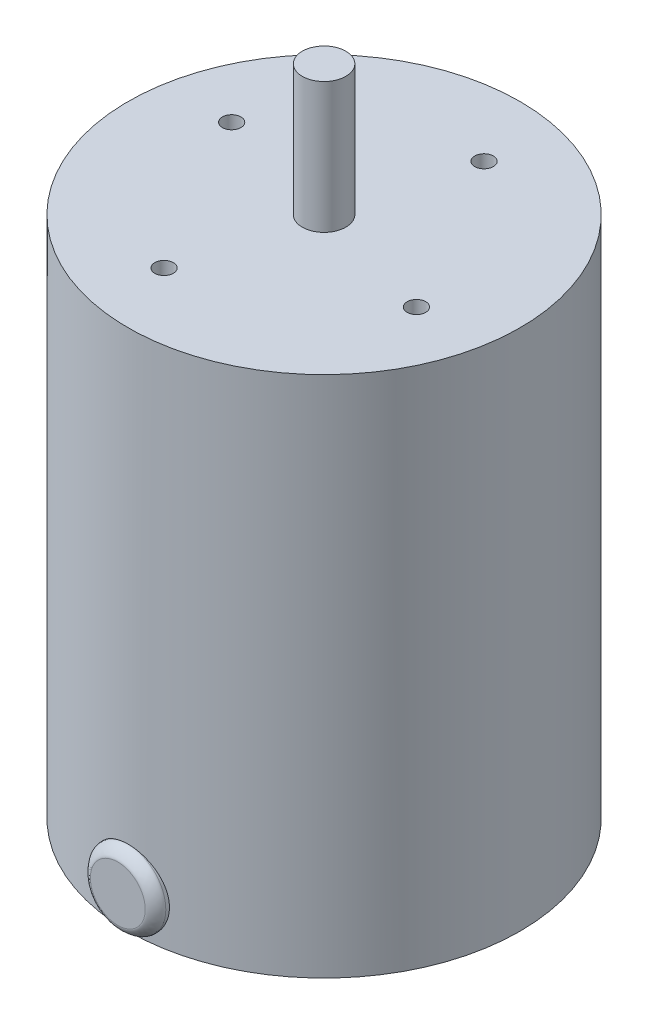
ISO-10303-21;
HEADER;
FILE_DESCRIPTION(('STEP AP214'),'2;1');
FILE_NAME('part.step','',(''),(''),'','','');
FILE_SCHEMA(('AUTOMOTIVE_DESIGN { 1 0 10303 214 1 1 1 1 }'));
ENDSEC;
DATA;
#1=APPLICATION_CONTEXT('core data for automotive mechanical design processes');
#2=APPLICATION_PROTOCOL_DEFINITION('international standard','automotive_design',2000,#1);
#3=PRODUCT_CONTEXT('',#1,'mechanical');
#4=PRODUCT('Part','Part','',(#3));
#5=PRODUCT_RELATED_PRODUCT_CATEGORY('part','',(#4));
#6=PRODUCT_DEFINITION_FORMATION('','',#4);
#7=PRODUCT_DEFINITION_CONTEXT('part definition',#1,'design');
#8=PRODUCT_DEFINITION('design','',#6,#7);
#9=PRODUCT_DEFINITION_SHAPE('','',#8);
#10=(LENGTH_UNIT() NAMED_UNIT(*) SI_UNIT(.MILLI.,.METRE.));
#11=(NAMED_UNIT(*) PLANE_ANGLE_UNIT() SI_UNIT($,.RADIAN.));
#12=(NAMED_UNIT(*) SI_UNIT($,.STERADIAN.) SOLID_ANGLE_UNIT());
#13=UNCERTAINTY_MEASURE_WITH_UNIT(LENGTH_MEASURE(1.E-05),#10,'distance_accuracy_value','');
#14=(GEOMETRIC_REPRESENTATION_CONTEXT(3) GLOBAL_UNCERTAINTY_ASSIGNED_CONTEXT((#13)) GLOBAL_UNIT_ASSIGNED_CONTEXT((#10,
#11,#12)) REPRESENTATION_CONTEXT('',''));
#15=CARTESIAN_POINT('',(0.,0.,0.));
#16=DIRECTION('',(0.,0.,1.));
#17=DIRECTION('',(1.,0.,0.));
#18=AXIS2_PLACEMENT_3D('',#15,#16,#17);
#19=CARTESIAN_POINT('',(0.,-32.6,30.075));
#20=DIRECTION('',(0.,0.,-1.));
#21=DIRECTION('',(-1.,0.,0.));
#22=AXIS2_PLACEMENT_3D('',#19,#20,#21);
#23=CYLINDRICAL_SURFACE('',#22,5.5);
#24=CARTESIAN_POINT('',(0.,-38.1,28.575));
#25=CARTESIAN_POINT('',(-0.153006913270102,-38.1000028735161,28.5750014135195));
#26=CARTESIAN_POINT('',(-0.30597716622993,-38.0936134209994,28.5737689058255));
#27=CARTESIAN_POINT('',(-0.610860455419747,-38.0681112960101,28.5688763669221));
#28=CARTESIAN_POINT('',(-0.762773300984089,-38.0489963860849,28.5652159088188));
#29=CARTESIAN_POINT('',(-1.06448198799602,-37.9981755090113,28.5555652321025));
#30=CARTESIAN_POINT('',(-1.2142766311677,-37.9664626887916,28.5495737454819));
#31=CARTESIAN_POINT('',(-1.51066151612007,-37.8906810230845,28.5354261414936));
#32=CARTESIAN_POINT('',(-1.65725055925804,-37.8466076380847,28.5272692289154));
#33=CARTESIAN_POINT('',(-1.94594968145314,-37.7465125893899,28.509030160619));
#34=CARTESIAN_POINT('',(-2.08806536884419,-37.6905066313405,28.4989505373798));
#35=CARTESIAN_POINT('',(-2.36709411085716,-37.5669062573569,28.4771326380655));
#36=CARTESIAN_POINT('',(-2.50400522445668,-37.4993075687734,28.4653937507288));
#37=CARTESIAN_POINT('',(-2.77158206846477,-37.3530589140845,28.4405872944954));
#38=CARTESIAN_POINT('',(-2.90225063305323,-37.2744140282082,28.4275203371473));
#39=CARTESIAN_POINT('',(-3.15658604520836,-37.1065716546991,28.4004041200368));
#40=CARTESIAN_POINT('',(-3.28025025588675,-37.01737023144,28.3863544947254));
#41=CARTESIAN_POINT('',(-3.52101462857159,-36.8280215311307,28.3575024217761));
#42=CARTESIAN_POINT('',(-3.63802843220877,-36.7277654279228,28.3426934319385));
#43=CARTESIAN_POINT('',(-3.86326379842358,-36.5177684185142,28.3128721805949));
#44=CARTESIAN_POINT('',(-3.97148208756064,-36.4080240121122,28.2978598458127));
#45=CARTESIAN_POINT('',(-4.17831387498992,-36.1798597018492,28.2680603342919));
#46=CARTESIAN_POINT('',(-4.27693017202682,-36.06144234368,28.2532730930107));
#47=CARTESIAN_POINT('',(-4.4639497173238,-35.8166575929403,28.2243288281481));
#48=CARTESIAN_POINT('',(-4.55234918539136,-35.6902872843451,28.2101720390152));
#49=CARTESIAN_POINT('',(-4.71893817882935,-35.4294451511424,28.182786130692));
#50=CARTESIAN_POINT('',(-4.79704005215595,-35.2949164375197,28.1695653701697));
#51=CARTESIAN_POINT('',(-4.94164550633549,-35.0195731361716,28.1445581122772));
#52=CARTESIAN_POINT('',(-5.00814474048044,-34.8787562173961,28.1327721529258));
#53=CARTESIAN_POINT('',(-5.12898008780221,-34.5919229128405,28.110993726943));
#54=CARTESIAN_POINT('',(-5.18332156701068,-34.4459088540214,28.1010004694598));
#55=CARTESIAN_POINT('',(-5.27947130272528,-34.1496714199404,28.0830939465203));
#56=CARTESIAN_POINT('',(-5.32127500517102,-33.9994465368049,28.0751814369764));
#57=CARTESIAN_POINT('',(-5.42641641667282,-33.5478846709585,28.0551234835715));
#58=CARTESIAN_POINT('',(-5.47110126328113,-33.2418055786103,28.0463557488694));
#59=CARTESIAN_POINT('',(-5.50857561608414,-32.6265473225984,28.039018419718));
#60=CARTESIAN_POINT('',(-5.50137002997062,-32.3173684548671,28.0404478608405));
#61=CARTESIAN_POINT('',(-5.43584481115057,-31.7090255233731,28.0532223049872));
#62=CARTESIAN_POINT('',(-5.37823775245012,-31.4097819710705,28.0644290703804));
#63=CARTESIAN_POINT('',(-5.21464941311624,-30.8252995645064,28.0952828382323));
#64=CARTESIAN_POINT('',(-5.10866597700575,-30.5400613348988,28.1149302167721));
#65=CARTESIAN_POINT('',(-4.8506476878374,-29.9895987437647,28.1605935116213));
#66=CARTESIAN_POINT('',(-4.69832710097745,-29.7245116937642,28.1866487447762));
#67=CARTESIAN_POINT('',(-4.35215890624948,-29.2233924146247,28.2421666163911));
#68=CARTESIAN_POINT('',(-4.15830686522648,-28.9873632914286,28.271629618449));
#69=CARTESIAN_POINT('',(-3.73074628029132,-28.5469426321258,28.3312444214922));
#70=CARTESIAN_POINT('',(-3.49642858142874,-28.3431424483467,28.3613995294216));
#71=CARTESIAN_POINT('',(-2.99662085427498,-27.9776509978255,28.4185512371304));
#72=CARTESIAN_POINT('',(-2.73113048075516,-27.8159601974967,28.4455478019232));
#73=CARTESIAN_POINT('',(-2.17588124314585,-27.5391814449428,28.4933996402519));
#74=CARTESIAN_POINT('',(-1.88608976197189,-27.4241573774253,28.5142464845147));
#75=CARTESIAN_POINT('',(-1.29080690996615,-27.244587828321,28.547385349609));
#76=CARTESIAN_POINT('',(-0.985317302247446,-27.1800366910862,28.5596783289105));
#77=CARTESIAN_POINT('',(-0.372395262036268,-27.1040739846306,28.5741920085104));
#78=CARTESIAN_POINT('',(-0.0650667196554244,-27.0918525484739,28.5765662001922));
#79=CARTESIAN_POINT('',(0.547241892603683,-27.1187203916882,28.571399705022));
#80=CARTESIAN_POINT('',(0.852222083514206,-27.157807008634,28.563859532636));
#81=CARTESIAN_POINT('',(1.44859078263083,-27.2855082661918,28.5398072946956));
#82=CARTESIAN_POINT('',(1.74007079649478,-27.3737108661614,28.523369900809));
#83=CARTESIAN_POINT('',(2.30410518271477,-27.5966928245188,28.4833590061907));
#84=CARTESIAN_POINT('',(2.57665821537438,-27.7314754759253,28.4597850009444));
#85=CARTESIAN_POINT('',(3.09854227741436,-28.0455679047289,28.407733057872));
#86=CARTESIAN_POINT('',(3.34757178905354,-28.2253696974633,28.3792020764164));
#87=CARTESIAN_POINT('',(3.81221454843162,-28.6237345658765,28.3205330168833));
#88=CARTESIAN_POINT('',(4.02782449204317,-28.8423014696111,28.2903947802951));
#89=CARTESIAN_POINT('',(4.42260437180253,-29.315662584127,28.2313953762539));
#90=CARTESIAN_POINT('',(4.60122031736766,-29.5709222510487,28.2025580733283));
#91=CARTESIAN_POINT('',(4.91303893990689,-30.1083105207375,28.1499163254468));
#92=CARTESIAN_POINT('',(5.046243358359,-30.3904380926215,28.1261116875075));
#93=CARTESIAN_POINT('',(5.26268843220945,-30.9721243169855,28.0864173876549));
#94=CARTESIAN_POINT('',(5.34617741890155,-31.2715879930546,28.0704884551131));
#95=CARTESIAN_POINT('',(5.46156497510848,-31.8808025750062,28.0482713700177));
#96=CARTESIAN_POINT('',(5.49346971637552,-32.1905522457034,28.0419820641442));
#97=CARTESIAN_POINT('',(5.50186978100187,-32.6529844630014,28.0403264865681));
#98=CARTESIAN_POINT('',(5.49827612031194,-32.8055458737975,28.0410350475612));
#99=CARTESIAN_POINT('',(5.47843944730317,-33.1097969680083,28.044918767282));
#100=CARTESIAN_POINT('',(5.4622012233326,-33.2614869595187,28.0480929922906));
#101=CARTESIAN_POINT('',(5.41718957246093,-33.5629686185655,28.0568208399768));
#102=CARTESIAN_POINT('',(5.38841173655711,-33.7127595993171,28.0623752995478));
#103=CARTESIAN_POINT('',(5.31856071844819,-34.0092913227827,28.0756977066599));
#104=CARTESIAN_POINT('',(5.27749193162675,-34.1560331358851,28.0834648628679));
#105=CARTESIAN_POINT('',(5.18345025732903,-34.4452443569294,28.1009741619849));
#106=CARTESIAN_POINT('',(5.13049820122538,-34.5877207526753,28.1107128459153));
#107=CARTESIAN_POINT('',(5.0130635003011,-34.8676471527138,28.1318924992467));
#108=CARTESIAN_POINT('',(4.94858494693893,-35.0050989197695,28.1433328643758));
#109=CARTESIAN_POINT('',(4.80851965042266,-35.2741638102336,28.1676022192011));
#110=CARTESIAN_POINT('',(4.73292835636715,-35.4057745127183,28.1804317772313));
#111=CARTESIAN_POINT('',(4.57121456544707,-35.6621829251598,28.2071149374004));
#112=CARTESIAN_POINT('',(4.48509570390442,-35.7869829655257,28.2209681853945));
#113=CARTESIAN_POINT('',(4.3014205620418,-36.0309576404473,28.2495518584386));
#114=CARTESIAN_POINT('',(4.20370215904739,-36.1500090189107,28.2642928302081));
#115=CARTESIAN_POINT('',(3.99868402962972,-36.379442585021,28.2940253981186));
#116=CARTESIAN_POINT('',(3.89138769486379,-36.4898278156319,28.3090169040261));
#117=CARTESIAN_POINT('',(3.66784441294628,-36.7012928784956,28.3388472211377));
#118=CARTESIAN_POINT('',(3.55159219672259,-36.8023671548039,28.3536859365397));
#119=CARTESIAN_POINT('',(3.31102156663799,-36.9944073762584,28.3827841011688));
#120=CARTESIAN_POINT('',(3.18670613965285,-37.0853770309942,28.3970437617495));
#121=CARTESIAN_POINT('',(2.92953146721386,-37.257469345533,28.4247314577111));
#122=CARTESIAN_POINT('',(2.79659941276987,-37.338484818735,28.4381497872752));
#123=CARTESIAN_POINT('',(2.52429708317203,-37.4889790467712,28.4636125798347));
#124=CARTESIAN_POINT('',(2.38492920358107,-37.5584620507124,28.4756575483268));
#125=CARTESIAN_POINT('',(2.10077161036086,-37.685366314255,28.4980292584493));
#126=CARTESIAN_POINT('',(1.95598536148904,-37.742795131672,28.508357075861));
#127=CARTESIAN_POINT('',(1.66199602267054,-37.8451888257538,28.52700660928));
#128=CARTESIAN_POINT('',(1.51279381371218,-37.8901561701897,28.5353287224385));
#129=CARTESIAN_POINT('',(1.13984644742973,-37.9854634805091,28.5531201540097));
#130=CARTESIAN_POINT('',(0.914091422433169,-38.028357961683,28.5612835498521));
#131=CARTESIAN_POINT('',(0.458863395995704,-38.0856236704625,28.5722223382772));
#132=CARTESIAN_POINT('',(0.229390498219257,-38.0999956919771,28.5749978808282));
#133=CARTESIAN_POINT('',(0.,-38.1,28.575));
#134=B_SPLINE_CURVE_WITH_KNOTS('',3,(#24,#25,#26,#27,#28,#29,#30,#31,#32,#33,#34,#35,#36,#37,
#38,#39,#40,#41,#42,#43,#44,#45,#46,#47,#48,#49,#50,#51,#52,#53,#54,#55,#56,#57,#58,#59,#60,#61,
#62,#63,#64,#65,#66,#67,#68,#69,#70,#71,#72,#73,#74,#75,#76,#77,#78,#79,#80,#81,#82,#83,#84,#85,
#86,#87,#88,#89,#90,#91,#92,#93,#94,#95,#96,#97,#98,#99,#100,#101,#102,#103,#104,#105,#106,#107,
#108,#109,#110,#111,#112,#113,#114,#115,#116,#117,#118,#119,#120,#121,#122,#123,#124,#125,#126,
#127,#128,#129,#130,#131,#132,#133),.UNSPECIFIED.,.T.,.F.,(4,2,2,2,2,2,2,2,2,2,2,2,2,2,2,2,2,2,
2,2,2,2,2,2,2,2,2,2,2,2,2,2,2,2,2,2,2,2,2,2,2,2,2,2,2,2,2,2,2,2,2,2,2,2,4),(0.,
0.458819403409944,0.917719500020108,1.37686957389095,1.8361884954739,2.29490655581416,
2.75379404735636,3.21247117996543,3.67131985580104,4.13517581318914,4.59920362151722,
5.06309576969436,5.5271590106308,5.99494732769927,6.46291051822147,6.93066675597898,
7.39859269028781,8.32203478910651,9.24538955179333,10.1558971492176,11.0664453195403,
11.9827262038859,12.8991049427579,13.8307217551799,14.76234888597,15.6952471046585,
16.6280407742273,17.5463449120161,18.4646013999846,19.3752681043937,20.2859992023786,
21.207154876872,22.1284015662141,23.062579773262,23.9967221516568,24.9261584211157,
25.8554834807487,26.3128529640386,26.7700493310333,27.2274065808903,27.68460046964,
28.1409990726139,28.5972359923469,29.0536602738805,29.5099273883494,29.9735563702864,
30.4370218221787,30.9007620612643,31.3643314862648,31.8325214897195,32.3005386050483,
32.7682613974682,33.2358914994884,33.9237802946051,34.6116499423973),.UNSPECIFIED.);
#135=CARTESIAN_POINT('',(0.,-38.1,28.575));
#136=VERTEX_POINT('',#135);
#137=CARTESIAN_POINT('',(0.,-27.1,28.575));
#138=VERTEX_POINT('',#137);
#139=EDGE_CURVE('E116',#136,#138,#134,.T.);
#140=ORIENTED_EDGE('',*,*,#139,.F.);
#141=CARTESIAN_POINT('',(5.5,-32.6,28.575));
#142=CARTESIAN_POINT('',(5.5,-31.8800516910487,28.575));
#143=CARTESIAN_POINT('',(5.35684971880548,-31.1603866290945,28.575));
#144=CARTESIAN_POINT('',(4.80582513881868,-29.8300956148895,28.575));
#145=CARTESIAN_POINT('',(4.39816762788755,-29.2199930348355,28.575));
#146=CARTESIAN_POINT('',(3.38000696516447,-28.2018323721124,28.575));
#147=CARTESIAN_POINT('',(2.76990438511094,-27.7941748611815,28.575));
#148=CARTESIAN_POINT('',(1.43961337090504,-27.2431502811943,28.575));
#149=CARTESIAN_POINT('',(0.7199483089482,-27.1,28.575));
#150=CARTESIAN_POINT('',(-0.719948308948199,-27.1,28.575));
#151=CARTESIAN_POINT('',(-1.43961337090421,-27.243150281194,28.575));
#152=CARTESIAN_POINT('',(-2.76990438511178,-27.7941748611818,28.575));
#153=CARTESIAN_POINT('',(-3.38000696516538,-28.2018323721134,28.575));
#154=CARTESIAN_POINT('',(-4.39816762788664,-29.2199930348346,28.575));
#155=CARTESIAN_POINT('',(-4.80582513881823,-29.8300956148884,28.575));
#156=CARTESIAN_POINT('',(-5.35684971880592,-31.1603866290956,28.575));
#157=CARTESIAN_POINT('',(-5.5,-31.8800516910483,28.575));
#158=CARTESIAN_POINT('',(-5.5,-33.3199483089517,28.575));
#159=CARTESIAN_POINT('',(-5.35684971880592,-34.0396133709044,28.575));
#160=CARTESIAN_POINT('',(-4.80582513881824,-35.3699043851116,28.575));
#161=CARTESIAN_POINT('',(-4.39816762788624,-35.9800069651658,28.575));
#162=CARTESIAN_POINT('',(-3.38000696516578,-36.9981676278862,28.575));
#163=CARTESIAN_POINT('',(-2.76990438511158,-37.4058251388182,28.575));
#164=CARTESIAN_POINT('',(-1.43961337090442,-37.9568497188059,28.575));
#165=CARTESIAN_POINT('',(-0.719948308948192,-38.1,28.575));
#166=CARTESIAN_POINT('',(0.719948308948209,-38.1,28.575));
#167=CARTESIAN_POINT('',(1.43961337090514,-37.9568497188056,28.575));
#168=CARTESIAN_POINT('',(2.76990438511083,-37.4058251388185,28.575));
#169=CARTESIAN_POINT('',(3.38000696516519,-36.9981676278868,28.575));
#170=CARTESIAN_POINT('',(4.3981676278868,-35.9800069651652,28.575));
#171=CARTESIAN_POINT('',(4.80582513881865,-35.3699043851106,28.575));
#172=CARTESIAN_POINT('',(5.35684971880549,-34.0396133709054,28.575));
#173=CARTESIAN_POINT('',(5.5,-33.3199483089513,28.575));
#174=CARTESIAN_POINT('',(5.5,-32.6,28.575));
#175=(BOUNDED_CURVE() B_SPLINE_CURVE(3,(#141,#142,#143,#144,#145,#146,#147,#148,#149,#150,#151,
#152,#153,#154,#155,#156,#157,#158,#159,#160,#161,#162,#163,#164,#165,#166,#167,#168,#169,#170,
#171,#172,#173,#174),.UNSPECIFIED.,.T.,.F.) B_SPLINE_CURVE_WITH_KNOTS((4,2,2,2,2,2,2,2,2,2,2,2,
2,2,2,2,4),(0.,0.392699081698724,0.785398163397448,1.17809724509617,1.5707963267949,
1.96349540849362,2.35619449019234,2.74889357189107,3.14159265358979,3.53429173528852,
3.92699081698724,4.31968989868597,4.71238898038469,5.10508806208341,5.49778714378214,
5.89048622548086,6.28318530717959),
.UNSPECIFIED.) CURVE() GEOMETRIC_REPRESENTATION_ITEM() RATIONAL_B_SPLINE_CURVE((0.999999999999998,
0.999999999999998,0.999999999999998,0.999999999999998,0.999999999999998,0.999999999999998,
0.999999999999998,0.999999999999998,0.999999999999998,0.999999999999998,0.999999999999998,
0.999999999999998,0.999999999999998,0.999999999999998,0.999999999999998,0.999999999999998,
0.999999999999998,0.999999999999998,0.999999999999998,0.999999999999998,0.999999999999998,
0.999999999999998,0.999999999999998,0.999999999999998,0.999999999999998,0.999999999999998,
0.999999999999998,0.999999999999998,0.999999999999998,0.999999999999998,0.999999999999998,
0.999999999999998,0.999999999999998,0.999999999999998)) REPRESENTATION_ITEM(''));
#176=EDGE_CURVE('E12',#136,#138,#175,.F.);
#177=ORIENTED_EDGE('',*,*,#176,.T.);
#178=EDGE_LOOP('',(#140,#177));
#179=FACE_BOUND('',#178,.T.);
#180=ADVANCED_FACE('F40',(#179),#23,.T.);
#181=CARTESIAN_POINT('',(0.,0.,0.));
#182=DIRECTION('',(0.,-1.,0.));
#183=DIRECTION('',(0.,0.,-1.));
#184=AXIS2_PLACEMENT_3D('',#181,#182,#183);
#185=CYLINDRICAL_SURFACE('',#184,28.575);
#186=CARTESIAN_POINT('',(0.,38.1,0.));
#187=DIRECTION('',(0.,-1.,0.));
#188=DIRECTION('',(0.,0.,-1.));
#189=AXIS2_PLACEMENT_3D('',#186,#187,#188);
#190=CIRCLE('',#189,28.575);
#191=CARTESIAN_POINT('',(0.,38.1,-28.575));
#192=VERTEX_POINT('',#191);
#193=EDGE_CURVE('E119',#192,#192,#190,.T.);
#194=ORIENTED_EDGE('',*,*,#193,.T.);
#195=EDGE_LOOP('',(#194));
#196=FACE_BOUND('',#195,.T.);
#197=CARTESIAN_POINT('',(0.,-38.1,0.));
#198=DIRECTION('',(0.,-1.,0.));
#199=DIRECTION('',(0.,0.,-1.));
#200=AXIS2_PLACEMENT_3D('',#197,#198,#199);
#201=CIRCLE('',#200,28.575);
#202=EDGE_CURVE('E122',#136,#136,#201,.T.);
#203=ORIENTED_EDGE('',*,*,#202,.F.);
#204=ORIENTED_EDGE('',*,*,#139,.T.);
#205=EDGE_CURVE('E111',#138,#136,#134,.T.);
#206=ORIENTED_EDGE('',*,*,#205,.T.);
#207=EDGE_LOOP('',(#203,#204,#206));
#208=FACE_BOUND('',#207,.T.);
#209=ADVANCED_FACE('F134',(#196,#208),#185,.T.);
#210=CARTESIAN_POINT('',(3.175,57.15,0.));
#211=DIRECTION('',(0.,1.,0.));
#212=DIRECTION('',(0.,0.,1.));
#213=AXIS2_PLACEMENT_3D('',#210,#211,#212);
#214=PLANE('',#213);
#215=CARTESIAN_POINT('',(0.,57.15,0.));
#216=DIRECTION('',(0.,-1.,0.));
#217=DIRECTION('',(0.,0.,-1.));
#218=AXIS2_PLACEMENT_3D('',#215,#216,#217);
#219=CIRCLE('',#218,3.175);
#220=CARTESIAN_POINT('',(0.,57.15,-3.175));
#221=VERTEX_POINT('',#220);
#222=EDGE_CURVE('E112',#221,#221,#219,.T.);
#223=ORIENTED_EDGE('',*,*,#222,.F.);
#224=EDGE_LOOP('',(#223));
#225=FACE_BOUND('',#224,.T.);
#226=ADVANCED_FACE('F202',(#225),#214,.T.);
#227=CARTESIAN_POINT('',(0.,-38.1,0.));
#228=DIRECTION('',(0.,-1.,0.));
#229=DIRECTION('',(0.,0.,-1.));
#230=AXIS2_PLACEMENT_3D('',#227,#228,#229);
#231=PLANE('',#230);
#232=ORIENTED_EDGE('',*,*,#202,.T.);
#233=EDGE_LOOP('',(#232));
#234=FACE_BOUND('',#233,.T.);
#235=ADVANCED_FACE('F208',(#234),#231,.T.);
#236=CARTESIAN_POINT('',(28.575,38.1,0.));
#237=DIRECTION('',(0.,1.,0.));
#238=DIRECTION('',(0.,0.,1.));
#239=AXIS2_PLACEMENT_3D('',#236,#237,#238);
#240=PLANE('',#239);
#241=CARTESIAN_POINT('',(-18.4008869908067,38.1,-4.93050280920309));
#242=DIRECTION('',(0.,1.,0.));
#243=DIRECTION('',(0.,0.,1.));
#244=AXIS2_PLACEMENT_3D('',#241,#242,#243);
#245=CIRCLE('',#244,1.35255);
#246=CARTESIAN_POINT('',(-18.4008869908067,38.1,-3.57795280920309));
#247=VERTEX_POINT('',#246);
#248=EDGE_CURVE('E89',#247,#247,#245,.T.);
#249=ORIENTED_EDGE('',*,*,#248,.F.);
#250=EDGE_LOOP('',(#249));
#251=FACE_BOUND('',#250,.T.);
#252=CARTESIAN_POINT('',(-4.9305028092029,38.1,18.4008869908068));
#253=DIRECTION('',(0.,1.,0.));
#254=DIRECTION('',(0.,0.,1.));
#255=AXIS2_PLACEMENT_3D('',#252,#253,#254);
#256=CIRCLE('',#255,1.35255);
#257=CARTESIAN_POINT('',(-4.9305028092029,38.1,19.7534369908068));
#258=VERTEX_POINT('',#257);
#259=EDGE_CURVE('E88',#258,#258,#256,.T.);
#260=ORIENTED_EDGE('',*,*,#259,.F.);
#261=EDGE_LOOP('',(#260));
#262=FACE_BOUND('',#261,.T.);
#263=CARTESIAN_POINT('',(18.4008869908068,38.1,4.93050280920296));
#264=DIRECTION('',(0.,1.,0.));
#265=DIRECTION('',(0.,0.,1.));
#266=AXIS2_PLACEMENT_3D('',#263,#264,#265);
#267=CIRCLE('',#266,1.35255);
#268=CARTESIAN_POINT('',(18.4008869908068,38.1,6.28305280920296));
#269=VERTEX_POINT('',#268);
#270=EDGE_CURVE('E99',#269,#269,#267,.T.);
#271=ORIENTED_EDGE('',*,*,#270,.F.);
#272=EDGE_LOOP('',(#271));
#273=FACE_BOUND('',#272,.T.);
#274=CARTESIAN_POINT('',(4.9305028092029,38.1,-18.4008869908068));
#275=DIRECTION('',(0.,1.,0.));
#276=DIRECTION('',(0.,0.,1.));
#277=AXIS2_PLACEMENT_3D('',#274,#275,#276);
#278=CIRCLE('',#277,1.35255);
#279=CARTESIAN_POINT('',(4.9305028092029,38.1,-17.0483369908068));
#280=VERTEX_POINT('',#279);
#281=EDGE_CURVE('E105',#280,#280,#278,.T.);
#282=ORIENTED_EDGE('',*,*,#281,.F.);
#283=EDGE_LOOP('',(#282));
#284=FACE_BOUND('',#283,.T.);
#285=CARTESIAN_POINT('',(0.,38.1,0.));
#286=DIRECTION('',(0.,-1.,0.));
#287=DIRECTION('',(0.,0.,-1.));
#288=AXIS2_PLACEMENT_3D('',#285,#286,#287);
#289=CIRCLE('',#288,3.175);
#290=CARTESIAN_POINT('',(0.,38.1,-3.175));
#291=VERTEX_POINT('',#290);
#292=EDGE_CURVE('E115',#291,#291,#289,.T.);
#293=ORIENTED_EDGE('',*,*,#292,.T.);
#294=EDGE_LOOP('',(#293));
#295=FACE_BOUND('',#294,.T.);
#296=ORIENTED_EDGE('',*,*,#193,.F.);
#297=EDGE_LOOP('',(#296));
#298=FACE_BOUND('',#297,.T.);
#299=ADVANCED_FACE('F217',(#251,#262,#273,#284,#295,#298),#240,.T.);
#300=CARTESIAN_POINT('',(0.,0.,0.));
#301=DIRECTION('',(0.,-1.,0.));
#302=DIRECTION('',(0.,0.,-1.));
#303=AXIS2_PLACEMENT_3D('',#300,#301,#302);
#304=CYLINDRICAL_SURFACE('',#303,3.175);
#305=ORIENTED_EDGE('',*,*,#222,.T.);
#306=EDGE_LOOP('',(#305));
#307=FACE_BOUND('',#306,.T.);
#308=ORIENTED_EDGE('',*,*,#292,.F.);
#309=EDGE_LOOP('',(#308));
#310=FACE_BOUND('',#309,.T.);
#311=ADVANCED_FACE('F144',(#307,#310),#304,.T.);
#312=ORIENTED_EDGE('',*,*,#205,.F.);
#313=CARTESIAN_POINT('',(5.5,-32.6,28.575));
#314=CARTESIAN_POINT('',(5.5,-31.8800516910487,28.575));
#315=CARTESIAN_POINT('',(5.35684971880548,-31.1603866290945,28.575));
#316=CARTESIAN_POINT('',(4.80582513881868,-29.8300956148895,28.575));
#317=CARTESIAN_POINT('',(4.39816762788755,-29.2199930348355,28.575));
#318=CARTESIAN_POINT('',(3.38000696516447,-28.2018323721125,28.575));
#319=CARTESIAN_POINT('',(2.76990438511094,-27.7941748611815,28.575));
#320=CARTESIAN_POINT('',(1.43961337090504,-27.2431502811944,28.575));
#321=CARTESIAN_POINT('',(0.7199483089482,-27.1,28.575));
#322=CARTESIAN_POINT('',(-0.7199483089482,-27.1,28.575));
#323=CARTESIAN_POINT('',(-1.43961337090421,-27.243150281194,28.575));
#324=CARTESIAN_POINT('',(-2.76990438511178,-27.7941748611818,28.575));
#325=CARTESIAN_POINT('',(-3.38000696516539,-28.2018323721134,28.575));
#326=CARTESIAN_POINT('',(-4.39816762788664,-29.2199930348346,28.575));
#327=CARTESIAN_POINT('',(-4.80582513881823,-29.8300956148884,28.575));
#328=CARTESIAN_POINT('',(-5.35684971880592,-31.1603866290956,28.575));
#329=CARTESIAN_POINT('',(-5.5,-31.8800516910483,28.575));
#330=CARTESIAN_POINT('',(-5.5,-33.3199483089517,28.575));
#331=CARTESIAN_POINT('',(-5.35684971880592,-34.0396133709044,28.575));
#332=CARTESIAN_POINT('',(-4.80582513881824,-35.3699043851116,28.575));
#333=CARTESIAN_POINT('',(-4.39816762788624,-35.9800069651658,28.575));
#334=CARTESIAN_POINT('',(-3.38000696516578,-36.9981676278863,28.575));
#335=CARTESIAN_POINT('',(-2.76990438511158,-37.4058251388182,28.575));
#336=CARTESIAN_POINT('',(-1.43961337090442,-37.9568497188059,28.575));
#337=CARTESIAN_POINT('',(-0.719948308948192,-38.1,28.575));
#338=CARTESIAN_POINT('',(0.719948308948209,-38.1,28.575));
#339=CARTESIAN_POINT('',(1.43961337090514,-37.9568497188056,28.575));
#340=CARTESIAN_POINT('',(2.76990438511083,-37.4058251388186,28.575));
#341=CARTESIAN_POINT('',(3.38000696516519,-36.9981676278868,28.575));
#342=CARTESIAN_POINT('',(4.39816762788681,-35.9800069651652,28.575));
#343=CARTESIAN_POINT('',(4.80582513881865,-35.3699043851106,28.575));
#344=CARTESIAN_POINT('',(5.35684971880549,-34.0396133709054,28.575));
#345=CARTESIAN_POINT('',(5.5,-33.3199483089513,28.575));
#346=CARTESIAN_POINT('',(5.5,-32.6,28.575));
#347=(BOUNDED_CURVE() B_SPLINE_CURVE(3,(#313,#314,#315,#316,#317,#318,#319,#320,#321,#322,#323,
#324,#325,#326,#327,#328,#329,#330,#331,#332,#333,#334,#335,#336,#337,#338,#339,#340,#341,#342,
#343,#344,#345,#346),.UNSPECIFIED.,.T.,.F.) B_SPLINE_CURVE_WITH_KNOTS((4,2,2,2,2,2,2,2,2,2,2,2,
2,2,2,2,4),(0.,0.392699081698724,0.785398163397448,1.17809724509617,1.5707963267949,
1.96349540849362,2.35619449019234,2.74889357189107,3.14159265358979,3.53429173528852,
3.92699081698724,4.31968989868597,4.71238898038469,5.10508806208341,5.49778714378214,
5.89048622548086,6.28318530717959),
.UNSPECIFIED.) CURVE() GEOMETRIC_REPRESENTATION_ITEM() RATIONAL_B_SPLINE_CURVE((0.999999999999972,
0.999999999999972,0.999999999999972,0.999999999999972,0.999999999999972,0.999999999999972,
0.999999999999972,0.999999999999972,0.999999999999972,0.999999999999972,0.999999999999972,
0.999999999999972,0.999999999999972,0.999999999999972,0.999999999999972,0.999999999999972,
0.999999999999972,0.999999999999972,0.999999999999972,0.999999999999972,0.999999999999972,
0.999999999999972,0.999999999999972,0.999999999999972,0.999999999999972,0.999999999999972,
0.999999999999972,0.999999999999972,0.999999999999972,0.999999999999972,0.999999999999972,
0.999999999999972,0.999999999999972,0.999999999999972)) REPRESENTATION_ITEM(''));
#348=EDGE_CURVE('E54',#138,#136,#347,.F.);
#349=ORIENTED_EDGE('',*,*,#348,.T.);
#350=EDGE_LOOP('',(#312,#349));
#351=FACE_BOUND('',#350,.T.);
#352=ADVANCED_FACE('F138',(#351),#23,.T.);
#353=CARTESIAN_POINT('',(0.,-32.6,30.075));
#354=DIRECTION('',(0.,0.,1.));
#355=DIRECTION('',(1.,0.,0.));
#356=AXIS2_PLACEMENT_3D('',#353,#354,#355);
#357=PLANE('',#356);
#358=CARTESIAN_POINT('',(4.,-32.6,30.075));
#359=CARTESIAN_POINT('',(4.,-33.1235987701454,30.075));
#360=CARTESIAN_POINT('',(3.8958907045861,-33.6469915424762,30.075));
#361=CARTESIAN_POINT('',(3.49514555550419,-34.6144759164445,30.075));
#362=CARTESIAN_POINT('',(3.19866736573617,-35.0581868837564,30.075));
#363=CARTESIAN_POINT('',(2.4581868837562,-35.798667365736,30.075));
#364=CARTESIAN_POINT('',(2.01447591644466,-36.0951455555057,30.075));
#365=CARTESIAN_POINT('',(1.04699154247604,-36.4958907045846,30.075));
#366=CARTESIAN_POINT('',(0.523598770144152,-36.6,30.075));
#367=CARTESIAN_POINT('',(-0.523598770144139,-36.6,30.075));
#368=CARTESIAN_POINT('',(-1.04699154247611,-36.4958907045864,30.075));
#369=CARTESIAN_POINT('',(-2.01447591644462,-36.0951455555039,30.075));
#370=CARTESIAN_POINT('',(-2.45818688375634,-35.7986673657348,30.075));
#371=CARTESIAN_POINT('',(-3.19866736573604,-35.0581868837576,30.075));
#372=CARTESIAN_POINT('',(-3.49514555550429,-34.6144759164454,30.075));
#373=CARTESIAN_POINT('',(-3.895890704586,-33.6469915424754,30.075));
#374=CARTESIAN_POINT('',(-4.,-33.1235987701457,30.075));
#375=CARTESIAN_POINT('',(-4.,-32.0764012298543,30.075));
#376=CARTESIAN_POINT('',(-3.89589070458611,-31.5530084575237,30.075));
#377=CARTESIAN_POINT('',(-3.49514555550418,-30.5855240835556,30.075));
#378=CARTESIAN_POINT('',(-3.19866736573593,-30.1418131162433,30.075));
#379=CARTESIAN_POINT('',(-2.45818688375646,-29.4013326342643,30.075));
#380=CARTESIAN_POINT('',(-2.01447591644464,-29.1048544444963,30.075));
#381=CARTESIAN_POINT('',(-1.04699154247608,-28.7041092954134,30.075));
#382=CARTESIAN_POINT('',(-0.523598770144145,-28.6,30.075));
#383=CARTESIAN_POINT('',(0.523598770144145,-28.6,30.075));
#384=CARTESIAN_POINT('',(1.04699154247613,-28.7041092954143,30.075));
#385=CARTESIAN_POINT('',(2.01447591644458,-29.1048544444954,30.075));
#386=CARTESIAN_POINT('',(2.45818688375639,-29.4013326342636,30.075));
#387=CARTESIAN_POINT('',(3.19866736573599,-30.1418131162441,30.075));
#388=CARTESIAN_POINT('',(3.49514555550427,-30.5855240835558,30.075));
#389=CARTESIAN_POINT('',(3.89589070458603,-31.5530084575235,30.075));
#390=CARTESIAN_POINT('',(4.,-32.0764012298546,30.075));
#391=CARTESIAN_POINT('',(4.,-32.6,30.075));
#392=(BOUNDED_CURVE() B_SPLINE_CURVE(3,(#358,#359,#360,#361,#362,#363,#364,#365,#366,#367,#368,
#369,#370,#371,#372,#373,#374,#375,#376,#377,#378,#379,#380,#381,#382,#383,#384,#385,#386,#387,
#388,#389,#390,#391),.UNSPECIFIED.,.T.,.F.) B_SPLINE_CURVE_WITH_KNOTS((4,2,2,2,2,2,2,2,2,2,2,2,
2,2,2,2,4),(0.,0.392699081698725,0.785398163397448,1.17809724509617,1.5707963267949,
1.96349540849362,2.35619449019234,2.74889357189107,3.14159265358979,3.53429173528852,
3.92699081698724,4.31968989868597,4.71238898038469,5.10508806208341,5.49778714378214,
5.89048622548086,6.28318530717959),
.UNSPECIFIED.) CURVE() GEOMETRIC_REPRESENTATION_ITEM() RATIONAL_B_SPLINE_CURVE((1.,1.,1.,1.,1.,
1.,1.,1.,1.,1.,1.,1.,1.,1.,1.,1.,1.,1.,1.,1.,1.,1.,1.,1.,1.,1.,1.,1.,1.,1.,1.,1.,1.,1.)) REPRESENTATION_ITEM(''));
#393=CARTESIAN_POINT('',(4.,-32.6,30.075));
#394=VERTEX_POINT('',#393);
#395=EDGE_CURVE('E162',#394,#394,#392,.F.);
#396=ORIENTED_EDGE('',*,*,#395,.T.);
#397=EDGE_LOOP('',(#396));
#398=FACE_BOUND('',#397,.T.);
#399=ADVANCED_FACE('F143',(#398),#357,.T.);
#400=CARTESIAN_POINT('',(4.9305028092029,32.1,-18.4008869908068));
#401=DIRECTION('',(0.,1.,0.));
#402=DIRECTION('',(0.,0.,1.));
#403=AXIS2_PLACEMENT_3D('',#400,#401,#402);
#404=CONICAL_SURFACE('',#403,1.35255,1.02974425867665);
#405=CARTESIAN_POINT('',(4.9305028092029,31.2873059697343,-18.4008869908068));
#406=VERTEX_POINT('',#405);
#407=VERTEX_LOOP('',#406);
#408=FACE_BOUND('',#407,.T.);
#409=CARTESIAN_POINT('',(4.9305028092029,32.1,-18.4008869908068));
#410=DIRECTION('',(0.,1.,0.));
#411=DIRECTION('',(0.,0.,1.));
#412=AXIS2_PLACEMENT_3D('',#409,#410,#411);
#413=CIRCLE('',#412,1.35255);
#414=CARTESIAN_POINT('',(4.9305028092029,32.1,-17.0483369908068));
#415=VERTEX_POINT('',#414);
#416=EDGE_CURVE('E108',#415,#415,#413,.T.);
#417=ORIENTED_EDGE('',*,*,#416,.T.);
#418=EDGE_LOOP('',(#417));
#419=FACE_BOUND('',#418,.T.);
#420=ADVANCED_FACE('F249',(#408,#419),#404,.F.);
#421=CARTESIAN_POINT('',(4.9305028092029,38.1,-18.4008869908068));
#422=DIRECTION('',(0.,1.,0.));
#423=DIRECTION('',(0.,0.,1.));
#424=AXIS2_PLACEMENT_3D('',#421,#422,#423);
#425=CYLINDRICAL_SURFACE('',#424,1.35255);
#426=ORIENTED_EDGE('',*,*,#416,.F.);
#427=EDGE_LOOP('',(#426));
#428=FACE_BOUND('',#427,.T.);
#429=ORIENTED_EDGE('',*,*,#281,.T.);
#430=EDGE_LOOP('',(#429));
#431=FACE_BOUND('',#430,.T.);
#432=ADVANCED_FACE('F255',(#428,#431),#425,.F.);
#433=CARTESIAN_POINT('',(18.4008869908068,32.1,4.93050280920296));
#434=DIRECTION('',(0.,1.,0.));
#435=DIRECTION('',(0.,0.,1.));
#436=AXIS2_PLACEMENT_3D('',#433,#434,#435);
#437=CONICAL_SURFACE('',#436,1.35255,1.02974425867665);
#438=CARTESIAN_POINT('',(18.4008869908068,31.2873059697343,4.93050280920296));
#439=VERTEX_POINT('',#438);
#440=VERTEX_LOOP('',#439);
#441=FACE_BOUND('',#440,.T.);
#442=CARTESIAN_POINT('',(18.4008869908068,32.1,4.93050280920296));
#443=DIRECTION('',(0.,1.,0.));
#444=DIRECTION('',(0.,0.,1.));
#445=AXIS2_PLACEMENT_3D('',#442,#443,#444);
#446=CIRCLE('',#445,1.35255);
#447=CARTESIAN_POINT('',(18.4008869908068,32.1,6.28305280920296));
#448=VERTEX_POINT('',#447);
#449=EDGE_CURVE('E102',#448,#448,#446,.T.);
#450=ORIENTED_EDGE('',*,*,#449,.T.);
#451=EDGE_LOOP('',(#450));
#452=FACE_BOUND('',#451,.T.);
#453=ADVANCED_FACE('F263',(#441,#452),#437,.F.);
#454=CARTESIAN_POINT('',(18.4008869908068,38.1,4.93050280920296));
#455=DIRECTION('',(0.,1.,0.));
#456=DIRECTION('',(0.,0.,1.));
#457=AXIS2_PLACEMENT_3D('',#454,#455,#456);
#458=CYLINDRICAL_SURFACE('',#457,1.35255);
#459=ORIENTED_EDGE('',*,*,#449,.F.);
#460=EDGE_LOOP('',(#459));
#461=FACE_BOUND('',#460,.T.);
#462=ORIENTED_EDGE('',*,*,#270,.T.);
#463=EDGE_LOOP('',(#462));
#464=FACE_BOUND('',#463,.T.);
#465=ADVANCED_FACE('F271',(#461,#464),#458,.F.);
#466=CARTESIAN_POINT('',(-4.9305028092029,32.1,18.4008869908068));
#467=DIRECTION('',(0.,1.,0.));
#468=DIRECTION('',(0.,0.,1.));
#469=AXIS2_PLACEMENT_3D('',#466,#467,#468);
#470=CONICAL_SURFACE('',#469,1.35255,1.02974425867665);
#471=CARTESIAN_POINT('',(-4.9305028092029,31.2873059697343,18.4008869908068));
#472=VERTEX_POINT('',#471);
#473=VERTEX_LOOP('',#472);
#474=FACE_BOUND('',#473,.T.);
#475=CARTESIAN_POINT('',(-4.9305028092029,32.1,18.4008869908068));
#476=DIRECTION('',(0.,1.,0.));
#477=DIRECTION('',(0.,0.,1.));
#478=AXIS2_PLACEMENT_3D('',#475,#476,#477);
#479=CIRCLE('',#478,1.35255);
#480=CARTESIAN_POINT('',(-4.9305028092029,32.1,19.7534369908068));
#481=VERTEX_POINT('',#480);
#482=EDGE_CURVE('E92',#481,#481,#479,.T.);
#483=ORIENTED_EDGE('',*,*,#482,.T.);
#484=EDGE_LOOP('',(#483));
#485=FACE_BOUND('',#484,.T.);
#486=ADVANCED_FACE('F280',(#474,#485),#470,.F.);
#487=CARTESIAN_POINT('',(-4.9305028092029,38.1,18.4008869908068));
#488=DIRECTION('',(0.,1.,0.));
#489=DIRECTION('',(0.,0.,1.));
#490=AXIS2_PLACEMENT_3D('',#487,#488,#489);
#491=CYLINDRICAL_SURFACE('',#490,1.35255);
#492=ORIENTED_EDGE('',*,*,#482,.F.);
#493=EDGE_LOOP('',(#492));
#494=FACE_BOUND('',#493,.T.);
#495=ORIENTED_EDGE('',*,*,#259,.T.);
#496=EDGE_LOOP('',(#495));
#497=FACE_BOUND('',#496,.T.);
#498=ADVANCED_FACE('F82',(#494,#497),#491,.F.);
#499=CARTESIAN_POINT('',(-18.4008869908067,32.1,-4.93050280920309));
#500=DIRECTION('',(0.,1.,0.));
#501=DIRECTION('',(0.,0.,1.));
#502=AXIS2_PLACEMENT_3D('',#499,#500,#501);
#503=CONICAL_SURFACE('',#502,1.35255,1.02974425867665);
#504=CARTESIAN_POINT('',(-18.4008869908067,31.2873059697343,-4.93050280920309));
#505=VERTEX_POINT('',#504);
#506=VERTEX_LOOP('',#505);
#507=FACE_BOUND('',#506,.T.);
#508=CARTESIAN_POINT('',(-18.4008869908067,32.1,-4.93050280920309));
#509=DIRECTION('',(0.,1.,0.));
#510=DIRECTION('',(0.,0.,1.));
#511=AXIS2_PLACEMENT_3D('',#508,#509,#510);
#512=CIRCLE('',#511,1.35255);
#513=CARTESIAN_POINT('',(-18.4008869908067,32.1,-3.57795280920309));
#514=VERTEX_POINT('',#513);
#515=EDGE_CURVE('E86',#514,#514,#512,.T.);
#516=ORIENTED_EDGE('',*,*,#515,.T.);
#517=EDGE_LOOP('',(#516));
#518=FACE_BOUND('',#517,.T.);
#519=ADVANCED_FACE('F78',(#507,#518),#503,.F.);
#520=CARTESIAN_POINT('',(-18.4008869908067,38.1,-4.93050280920309));
#521=DIRECTION('',(0.,1.,0.));
#522=DIRECTION('',(0.,0.,1.));
#523=AXIS2_PLACEMENT_3D('',#520,#521,#522);
#524=CYLINDRICAL_SURFACE('',#523,1.35255);
#525=ORIENTED_EDGE('',*,*,#515,.F.);
#526=EDGE_LOOP('',(#525));
#527=FACE_BOUND('',#526,.T.);
#528=ORIENTED_EDGE('',*,*,#248,.T.);
#529=EDGE_LOOP('',(#528));
#530=FACE_BOUND('',#529,.T.);
#531=ADVANCED_FACE('F81',(#527,#530),#524,.F.);
#532=CARTESIAN_POINT('',(4.,-32.6,30.075));
#533=CARTESIAN_POINT('',(4.,-32.0764012298546,30.075));
#534=CARTESIAN_POINT('',(3.89589070458603,-31.5530084575235,30.075));
#535=CARTESIAN_POINT('',(3.49514555550427,-30.5855240835558,30.075));
#536=CARTESIAN_POINT('',(3.19866736573599,-30.1418131162441,30.075));
#537=CARTESIAN_POINT('',(2.45818688375639,-29.4013326342636,30.075));
#538=CARTESIAN_POINT('',(2.01447591644458,-29.1048544444954,30.075));
#539=CARTESIAN_POINT('',(1.04699154247613,-28.7041092954143,30.075));
#540=CARTESIAN_POINT('',(0.523598770144145,-28.6,30.075));
#541=CARTESIAN_POINT('',(-0.523598770144145,-28.6,30.075));
#542=CARTESIAN_POINT('',(-1.04699154247608,-28.7041092954134,30.075));
#543=CARTESIAN_POINT('',(-2.01447591644464,-29.1048544444963,30.075));
#544=CARTESIAN_POINT('',(-2.45818688375646,-29.4013326342643,30.075));
#545=CARTESIAN_POINT('',(-3.19866736573593,-30.1418131162433,30.075));
#546=CARTESIAN_POINT('',(-3.49514555550418,-30.5855240835556,30.075));
#547=CARTESIAN_POINT('',(-3.89589070458611,-31.5530084575237,30.075));
#548=CARTESIAN_POINT('',(-4.,-32.0764012298543,30.075));
#549=CARTESIAN_POINT('',(-4.,-33.1235987701457,30.075));
#550=CARTESIAN_POINT('',(-3.895890704586,-33.6469915424754,30.075));
#551=CARTESIAN_POINT('',(-3.49514555550429,-34.6144759164454,30.075));
#552=CARTESIAN_POINT('',(-3.19866736573604,-35.0581868837576,30.075));
#553=CARTESIAN_POINT('',(-2.45818688375634,-35.7986673657348,30.075));
#554=CARTESIAN_POINT('',(-2.01447591644462,-36.0951455555039,30.075));
#555=CARTESIAN_POINT('',(-1.04699154247611,-36.4958907045864,30.075));
#556=CARTESIAN_POINT('',(-0.523598770144139,-36.6,30.075));
#557=CARTESIAN_POINT('',(0.523598770144152,-36.6,30.075));
#558=CARTESIAN_POINT('',(1.04699154247604,-36.4958907045846,30.075));
#559=CARTESIAN_POINT('',(2.01447591644466,-36.0951455555057,30.075));
#560=CARTESIAN_POINT('',(2.4581868837562,-35.798667365736,30.075));
#561=CARTESIAN_POINT('',(3.19866736573617,-35.0581868837564,30.075));
#562=CARTESIAN_POINT('',(3.49514555550419,-34.6144759164445,30.075));
#563=CARTESIAN_POINT('',(3.8958907045861,-33.6469915424762,30.075));
#564=CARTESIAN_POINT('',(4.,-33.1235987701454,30.075));
#565=CARTESIAN_POINT('',(4.,-32.6,30.075));
#566=CARTESIAN_POINT('',(5.5,-32.6,30.075));
#567=CARTESIAN_POINT('',(5.5,-31.8800516910487,30.0749999999991));
#568=CARTESIAN_POINT('',(5.35684971880559,-31.1603866290945,30.075));
#569=CARTESIAN_POINT('',(4.80582513881857,-29.8300956148895,30.075));
#570=CARTESIAN_POINT('',(4.39816762788795,-29.219993034837,30.0750000000018));
#571=CARTESIAN_POINT('',(3.38000696516407,-28.201832372111,30.0749999999982));
#572=CARTESIAN_POINT('',(2.76990438511121,-27.7941748611809,30.075));
#573=CARTESIAN_POINT('',(1.43961337090478,-27.243150281195,30.075));
#574=CARTESIAN_POINT('',(0.7199483089482,-27.1,30.075));
#575=CARTESIAN_POINT('',(-0.719948308948199,-27.1,30.075));
#576=CARTESIAN_POINT('',(-1.43961337090421,-27.2431502811932,30.0749999999991));
#577=CARTESIAN_POINT('',(-2.76990438511178,-27.7941748611827,30.0750000000009));
#578=CARTESIAN_POINT('',(-3.38000696516476,-28.2018323721126,30.0749999999991));
#579=CARTESIAN_POINT('',(-4.39816762788727,-29.2199930348354,30.0750000000009));
#580=CARTESIAN_POINT('',(-4.80582513881822,-29.8300956148874,30.075));
#581=CARTESIAN_POINT('',(-5.35684971880593,-31.1603866290966,30.075));
#582=CARTESIAN_POINT('',(-5.5,-31.8800516910483,30.075));
#583=CARTESIAN_POINT('',(-5.5,-33.3199483089517,30.075));
#584=CARTESIAN_POINT('',(-5.35684971880571,-34.0396133709043,30.075));
#585=CARTESIAN_POINT('',(-4.80582513881845,-35.3699043851117,30.075));
#586=CARTESIAN_POINT('',(-4.39816762788692,-35.9800069651665,30.075));
#587=CARTESIAN_POINT('',(-3.3800069651651,-36.9981676278856,30.075));
#588=CARTESIAN_POINT('',(-2.76990438511142,-37.4058251388176,30.075));
#589=CARTESIAN_POINT('',(-1.43961337090458,-37.9568497188066,30.075));
#590=CARTESIAN_POINT('',(-0.719948308948192,-38.1,30.075));
#591=CARTESIAN_POINT('',(0.719948308948209,-38.1,30.075));
#592=CARTESIAN_POINT('',(1.43961337090479,-37.9568497188048,30.075));
#593=CARTESIAN_POINT('',(2.76990438511117,-37.4058251388194,30.075));
#594=CARTESIAN_POINT('',(3.38000696516485,-36.9981676278865,30.075));
#595=CARTESIAN_POINT('',(4.39816762788714,-35.9800069651656,30.075));
#596=CARTESIAN_POINT('',(4.80582513881848,-35.3699043851105,30.075));
#597=CARTESIAN_POINT('',(5.35684971880567,-34.0396133709055,30.075));
#598=CARTESIAN_POINT('',(5.5,-33.3199483089513,30.0750000000009));
#599=CARTESIAN_POINT('',(5.5,-32.6,30.075));
#600=CARTESIAN_POINT('',(5.5,-32.6,28.575));
#601=CARTESIAN_POINT('',(5.5,-31.8800516910487,28.575));
#602=CARTESIAN_POINT('',(5.35684971880548,-31.1603866290945,28.575));
#603=CARTESIAN_POINT('',(4.80582513881868,-29.8300956148895,28.575));
#604=CARTESIAN_POINT('',(4.39816762788755,-29.2199930348355,28.575));
#605=CARTESIAN_POINT('',(3.38000696516447,-28.2018323721125,28.575));
#606=CARTESIAN_POINT('',(2.76990438511094,-27.7941748611815,28.575));
#607=CARTESIAN_POINT('',(1.43961337090504,-27.2431502811944,28.575));
#608=CARTESIAN_POINT('',(0.7199483089482,-27.1,28.575));
#609=CARTESIAN_POINT('',(-0.719948308948199,-27.1,28.575));
#610=CARTESIAN_POINT('',(-1.43961337090421,-27.243150281194,28.575));
#611=CARTESIAN_POINT('',(-2.76990438511178,-27.7941748611818,28.575));
#612=CARTESIAN_POINT('',(-3.38000696516539,-28.2018323721134,28.575));
#613=CARTESIAN_POINT('',(-4.39816762788664,-29.2199930348346,28.575));
#614=CARTESIAN_POINT('',(-4.80582513881823,-29.8300956148884,28.575));
#615=CARTESIAN_POINT('',(-5.35684971880592,-31.1603866290956,28.575));
#616=CARTESIAN_POINT('',(-5.5,-31.8800516910483,28.575));
#617=CARTESIAN_POINT('',(-5.5,-33.3199483089517,28.575));
#618=CARTESIAN_POINT('',(-5.35684971880592,-34.0396133709044,28.575));
#619=CARTESIAN_POINT('',(-4.80582513881824,-35.3699043851116,28.575));
#620=CARTESIAN_POINT('',(-4.39816762788624,-35.9800069651658,28.575));
#621=CARTESIAN_POINT('',(-3.38000696516578,-36.9981676278863,28.575));
#622=CARTESIAN_POINT('',(-2.76990438511158,-37.4058251388182,28.575));
#623=CARTESIAN_POINT('',(-1.43961337090442,-37.9568497188059,28.575));
#624=CARTESIAN_POINT('',(-0.719948308948192,-38.1,28.575));
#625=CARTESIAN_POINT('',(0.719948308948209,-38.1,28.575));
#626=CARTESIAN_POINT('',(1.43961337090514,-37.9568497188056,28.575));
#627=CARTESIAN_POINT('',(2.76990438511083,-37.4058251388186,28.575));
#628=CARTESIAN_POINT('',(3.38000696516519,-36.9981676278868,28.575));
#629=CARTESIAN_POINT('',(4.3981676278868,-35.9800069651652,28.575));
#630=CARTESIAN_POINT('',(4.80582513881865,-35.3699043851106,28.575));
#631=CARTESIAN_POINT('',(5.35684971880549,-34.0396133709054,28.575));
#632=CARTESIAN_POINT('',(5.5,-33.3199483089513,28.575));
#633=CARTESIAN_POINT('',(5.5,-32.6,28.575));
#634=(BOUNDED_SURFACE() B_SPLINE_SURFACE(2,3,((#532,#533,#534,#535,#536,#537,#538,#539,#540,
#541,#542,#543,#544,#545,#546,#547,#548,#549,#550,#551,#552,#553,#554,#555,#556,#557,#558,#559,
#560,#561,#562,#563,#564,#565),(#566,#567,#568,#569,#570,#571,#572,#573,#574,#575,#576,#577,
#578,#579,#580,#581,#582,#583,#584,#585,#586,#587,#588,#589,#590,#591,#592,#593,#594,#595,#596,
#597,#598,#599),(#600,#601,#602,#603,#604,#605,#606,#607,#608,#609,#610,#611,#612,#613,#614,
#615,#616,#617,#618,#619,#620,#621,#622,#623,#624,#625,#626,#627,#628,#629,#630,#631,#632,
#633)),.UNSPECIFIED.,.F.,.T.,.F.) B_SPLINE_SURFACE_WITH_KNOTS((3,3),(4,2,2,2,2,2,2,2,2,2,2,2,2,
2,2,2,4),(0.,1.),(0.,0.392699081698724,0.785398163397448,1.17809724509617,1.5707963267949,
1.96349540849362,2.35619449019234,2.74889357189107,3.14159265358979,3.53429173528852,
3.92699081698724,4.31968989868597,4.71238898038469,5.10508806208341,5.49778714378214,
5.89048622548086,6.28318530717959),
.UNSPECIFIED.) GEOMETRIC_REPRESENTATION_ITEM() RATIONAL_B_SPLINE_SURFACE(((1.,1.,1.,1.,1.,1.,1.,
1.,1.,1.,1.,1.,1.,1.,1.,1.,1.,1.,1.,1.,1.,1.,1.,1.,1.,1.,1.,1.,1.,1.,1.,1.,1.,1.),
(0.333333333333333,0.333333333333333,0.333333333333333,0.333333333333333,0.333333333333333,
0.333333333333333,0.333333333333333,0.333333333333333,0.333333333333333,0.333333333333333,
0.333333333333333,0.333333333333333,0.333333333333333,0.333333333333333,0.333333333333333,
0.333333333333333,0.333333333333333,0.333333333333333,0.333333333333333,0.333333333333333,
0.333333333333333,0.333333333333333,0.333333333333333,0.333333333333333,0.333333333333333,
0.333333333333333,0.333333333333333,0.333333333333333,0.333333333333333,0.333333333333333,
0.333333333333333,0.333333333333333,0.333333333333333,0.333333333333333),(1.,1.,1.,1.,1.,1.,1.,
1.,1.,1.,1.,1.,1.,1.,1.,1.,1.,1.,1.,1.,1.,1.,1.,1.,1.,1.,1.,1.,1.,1.,1.,1.,1.,1.))) REPRESENTATION_ITEM('') SURFACE());
#635=ORIENTED_EDGE('',*,*,#348,.F.);
#636=ORIENTED_EDGE('',*,*,#176,.F.);
#637=EDGE_LOOP('',(#635,#636));
#638=FACE_BOUND('',#637,.T.);
#639=ORIENTED_EDGE('',*,*,#395,.F.);
#640=EDGE_LOOP('',(#639));
#641=FACE_BOUND('',#640,.T.);
#642=ADVANCED_FACE('F43',(#638,#641),#634,.T.);
#643=CLOSED_SHELL('',(#180,#209,#226,#235,#299,#311,#352,#399,#420,#432,#453,#465,#486,#498,
#519,#531,#642));
#644=MANIFOLD_SOLID_BREP('B2',#643);
#645=ADVANCED_BREP_SHAPE_REPRESENTATION('',(#18,#644),#14);
#646=SHAPE_DEFINITION_REPRESENTATION(#9,#645);
ENDSEC;
END-ISO-10303-21;
